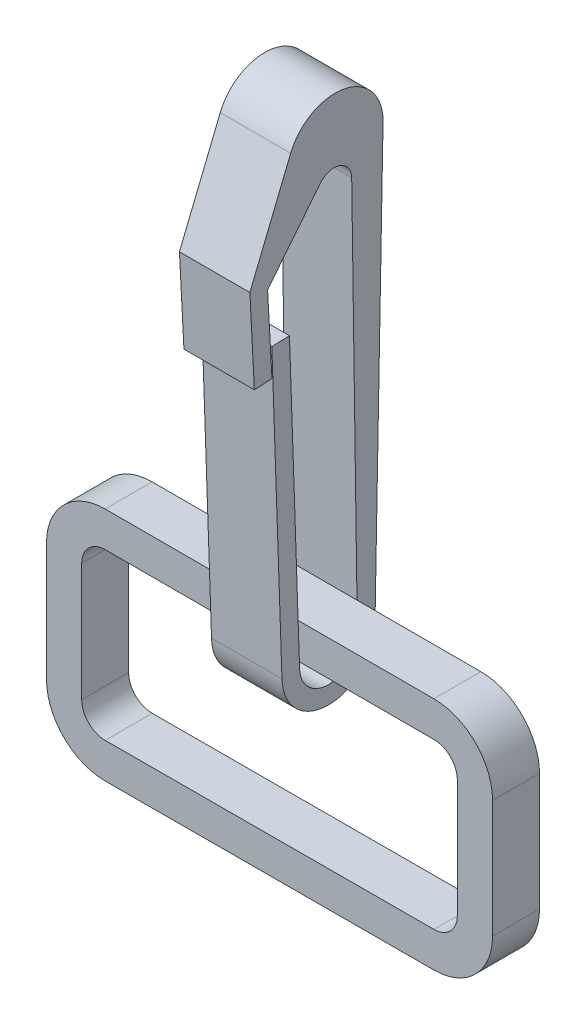
ISO-10303-21;
HEADER;
FILE_DESCRIPTION(('STEP AP214'),'2;1');
FILE_NAME('part.step','',(''),(''),'','','');
FILE_SCHEMA(('AUTOMOTIVE_DESIGN { 1 0 10303 214 1 1 1 1 }'));
ENDSEC;
DATA;
#1=APPLICATION_CONTEXT('core data for automotive mechanical design processes');
#2=APPLICATION_PROTOCOL_DEFINITION('international standard','automotive_design',2000,#1);
#3=PRODUCT_CONTEXT('',#1,'mechanical');
#4=PRODUCT('Part','Part','',(#3));
#5=PRODUCT_RELATED_PRODUCT_CATEGORY('part','',(#4));
#6=PRODUCT_DEFINITION_FORMATION('','',#4);
#7=PRODUCT_DEFINITION_CONTEXT('part definition',#1,'design');
#8=PRODUCT_DEFINITION('design','',#6,#7);
#9=PRODUCT_DEFINITION_SHAPE('','',#8);
#10=(LENGTH_UNIT() NAMED_UNIT(*) SI_UNIT(.MILLI.,.METRE.));
#11=(NAMED_UNIT(*) PLANE_ANGLE_UNIT() SI_UNIT($,.RADIAN.));
#12=(NAMED_UNIT(*) SI_UNIT($,.STERADIAN.) SOLID_ANGLE_UNIT());
#13=UNCERTAINTY_MEASURE_WITH_UNIT(LENGTH_MEASURE(1.E-05),#10,'distance_accuracy_value','');
#14=(GEOMETRIC_REPRESENTATION_CONTEXT(3) GLOBAL_UNCERTAINTY_ASSIGNED_CONTEXT((#13)) GLOBAL_UNIT_ASSIGNED_CONTEXT((#10,
#11,#12)) REPRESENTATION_CONTEXT('',''));
#15=CARTESIAN_POINT('',(0.,0.,0.));
#16=DIRECTION('',(0.,0.,1.));
#17=DIRECTION('',(1.,0.,0.));
#18=AXIS2_PLACEMENT_3D('',#15,#16,#17);
#19=CARTESIAN_POINT('',(15.9999597397409,17.0694992795226,1.97729722833447));
#20=DIRECTION('',(1.,0.,0.));
#21=DIRECTION('',(0.,0.,-1.));
#22=AXIS2_PLACEMENT_3D('',#19,#20,#21);
#23=CYLINDRICAL_SURFACE('',#22,2.46277891064654);
#24=DIRECTION('',(1.,0.,0.));
#25=VECTOR('',#24,1.);
#26=CARTESIAN_POINT('',(15.9999597397409,17.0469641502624,4.43997303539364));
#27=LINE('',#26,#25);
#28=CARTESIAN_POINT('',(15.9999597397409,17.0469641502624,4.43997303539364));
#29=VERTEX_POINT('',#28);
#30=CARTESIAN_POINT('',(21.9999597397409,17.0469641502624,4.43997303539364));
#31=VERTEX_POINT('',#30);
#32=EDGE_CURVE('E45',#29,#31,#27,.T.);
#33=ORIENTED_EDGE('',*,*,#32,.T.);
#34=CARTESIAN_POINT('',(21.9999597397409,17.0694992795226,1.97729722833447));
#35=DIRECTION('',(-1.,0.,0.));
#36=DIRECTION('',(0.,0.,1.));
#37=AXIS2_PLACEMENT_3D('',#34,#35,#36);
#38=CIRCLE('',#37,2.46277891064654);
#39=CARTESIAN_POINT('',(21.9999597397409,17.1257531872861,-0.48483913275252));
#40=VERTEX_POINT('',#39);
#41=EDGE_CURVE('E142',#40,#31,#38,.T.);
#42=ORIENTED_EDGE('',*,*,#41,.F.);
#43=DIRECTION('',(1.,0.,0.));
#44=VECTOR('',#43,1.);
#45=CARTESIAN_POINT('',(15.9999597397409,17.1257531872861,-0.48483913275252));
#46=LINE('',#45,#44);
#47=CARTESIAN_POINT('',(15.9999597397409,17.1257531872861,-0.48483913275252));
#48=VERTEX_POINT('',#47);
#49=EDGE_CURVE('E12',#48,#40,#46,.T.);
#50=ORIENTED_EDGE('',*,*,#49,.F.);
#51=CARTESIAN_POINT('',(15.9999597397409,17.0694992795226,1.97729722833447));
#52=DIRECTION('',(-1.,0.,0.));
#53=DIRECTION('',(0.,0.,1.));
#54=AXIS2_PLACEMENT_3D('',#51,#52,#53);
#55=CIRCLE('',#54,2.46277891064654);
#56=EDGE_CURVE('E143',#48,#29,#55,.T.);
#57=ORIENTED_EDGE('',*,*,#56,.T.);
#58=EDGE_LOOP('',(#33,#42,#50,#57));
#59=FACE_BOUND('',#58,.T.);
#60=ADVANCED_FACE('F42',(#59),#23,.F.);
#61=CARTESIAN_POINT('',(15.9999597397409,17.1257531872861,-0.48483913275252));
#62=DIRECTION('',(0.,-0.0143050781268201,0.999897677134908));
#63=DIRECTION('',(0.,-0.999897677134909,-0.0143050781268201));
#64=AXIS2_PLACEMENT_3D('',#61,#62,#63);
#65=PLANE('',#64);
#66=ORIENTED_EDGE('',*,*,#49,.T.);
#67=DIRECTION('',(0.,-0.999897677134909,-0.0143050781268201));
#68=VECTOR('',#67,1.);
#69=CARTESIAN_POINT('',(21.9999597397409,17.1257531872861,-0.48483913275252));
#70=LINE('',#69,#68);
#71=CARTESIAN_POINT('',(21.9999597397409,51.0258120976155,0.000153484297670892));
#72=VERTEX_POINT('',#71);
#73=EDGE_CURVE('E160',#72,#40,#70,.T.);
#74=ORIENTED_EDGE('',*,*,#73,.F.);
#75=DIRECTION('',(1.,0.,0.));
#76=VECTOR('',#75,1.);
#77=CARTESIAN_POINT('',(15.9999597397409,51.0258120976155,0.000153484297670892));
#78=LINE('',#77,#76);
#79=CARTESIAN_POINT('',(15.9999597397409,51.0258120976155,0.000153484297670892));
#80=VERTEX_POINT('',#79);
#81=EDGE_CURVE('E50',#80,#72,#78,.T.);
#82=ORIENTED_EDGE('',*,*,#81,.F.);
#83=DIRECTION('',(0.,-0.999897677134909,-0.0143050781268201));
#84=VECTOR('',#83,1.);
#85=CARTESIAN_POINT('',(15.9999597397409,17.1257531872861,-0.48483913275252));
#86=LINE('',#85,#84);
#87=EDGE_CURVE('E148',#80,#48,#86,.T.);
#88=ORIENTED_EDGE('',*,*,#87,.T.);
#89=EDGE_LOOP('',(#66,#74,#82,#88));
#90=FACE_BOUND('',#89,.T.);
#91=ADVANCED_FACE('F296',(#90),#65,.T.);
#92=CARTESIAN_POINT('',(15.9999597397409,51.0043544804253,1.5));
#93=DIRECTION('',(1.,0.,0.));
#94=DIRECTION('',(0.,0.,-1.));
#95=AXIS2_PLACEMENT_3D('',#92,#93,#94);
#96=CYLINDRICAL_SURFACE('',#95,1.49999999999998);
#97=ORIENTED_EDGE('',*,*,#81,.T.);
#98=CARTESIAN_POINT('',(21.9999597397409,51.0043544804253,1.5));
#99=DIRECTION('',(-1.,0.,0.));
#100=DIRECTION('',(0.,0.,1.));
#101=AXIS2_PLACEMENT_3D('',#98,#99,#100);
#102=CIRCLE('',#101,1.49999999999998);
#103=CARTESIAN_POINT('',(21.9999597397409,51.9420449274425,2.67078461963446));
#104=VERTEX_POINT('',#103);
#105=EDGE_CURVE('E191',#104,#72,#102,.T.);
#106=ORIENTED_EDGE('',*,*,#105,.F.);
#107=DIRECTION('',(1.,0.,0.));
#108=VECTOR('',#107,1.);
#109=CARTESIAN_POINT('',(15.9999597397409,51.9420449274425,2.67078461963446));
#110=LINE('',#109,#108);
#111=CARTESIAN_POINT('',(15.9999597397409,51.9420449274425,2.67078461963446));
#112=VERTEX_POINT('',#111);
#113=EDGE_CURVE('E231',#112,#104,#110,.T.);
#114=ORIENTED_EDGE('',*,*,#113,.F.);
#115=CARTESIAN_POINT('',(15.9999597397409,51.0043544804253,1.5));
#116=DIRECTION('',(-1.,0.,0.));
#117=DIRECTION('',(0.,0.,1.));
#118=AXIS2_PLACEMENT_3D('',#115,#116,#117);
#119=CIRCLE('',#118,1.49999999999998);
#120=EDGE_CURVE('E227',#112,#80,#119,.T.);
#121=ORIENTED_EDGE('',*,*,#120,.T.);
#122=EDGE_LOOP('',(#97,#106,#114,#121));
#123=FACE_BOUND('',#122,.T.);
#124=ADVANCED_FACE('F295',(#123),#96,.F.);
#125=CARTESIAN_POINT('',(15.9999597397409,51.9420449274425,2.67078461963448));
#126=DIRECTION('',(0.,-0.625126964678174,-0.780523079756296));
#127=DIRECTION('',(0.,0.780523079756296,-0.625126964678174));
#128=AXIS2_PLACEMENT_3D('',#125,#126,#127);
#129=PLANE('',#128);
#130=ORIENTED_EDGE('',*,*,#113,.T.);
#131=DIRECTION('',(0.,0.780523079756296,-0.625126964678174));
#132=VECTOR('',#131,1.);
#133=CARTESIAN_POINT('',(21.9999597397409,51.9420449274425,2.67078461963448));
#134=LINE('',#133,#132);
#135=CARTESIAN_POINT('',(21.9999597397409,46.3311054481699,7.16462939712118));
#136=VERTEX_POINT('',#135);
#137=EDGE_CURVE('E188',#136,#104,#134,.T.);
#138=ORIENTED_EDGE('',*,*,#137,.F.);
#139=DIRECTION('',(1.,0.,0.));
#140=VECTOR('',#139,1.);
#141=CARTESIAN_POINT('',(15.9999597397409,46.3311054481699,7.16462939712118));
#142=LINE('',#141,#140);
#143=CARTESIAN_POINT('',(15.9999597397409,46.3311054481699,7.16462939712118));
#144=VERTEX_POINT('',#143);
#145=EDGE_CURVE('E233',#144,#136,#142,.T.);
#146=ORIENTED_EDGE('',*,*,#145,.F.);
#147=DIRECTION('',(0.,0.780523079756296,-0.625126964678174));
#148=VECTOR('',#147,1.);
#149=CARTESIAN_POINT('',(15.9999597397409,51.9420449274425,2.67078461963448));
#150=LINE('',#149,#148);
#151=EDGE_CURVE('E224',#144,#112,#150,.T.);
#152=ORIENTED_EDGE('',*,*,#151,.T.);
#153=EDGE_LOOP('',(#130,#138,#146,#152));
#154=FACE_BOUND('',#153,.T.);
#155=ADVANCED_FACE('F291',(#154),#129,.T.);
#156=CARTESIAN_POINT('',(15.9999597397409,39.5964449052052,6.7930216978305));
#157=DIRECTION('',(0.,0.0550945778124409,-0.99848114028041));
#158=DIRECTION('',(0.,0.998481140280411,0.055094577812441));
#159=AXIS2_PLACEMENT_3D('',#156,#157,#158);
#160=PLANE('',#159);
#161=ORIENTED_EDGE('',*,*,#145,.T.);
#162=DIRECTION('',(0.,0.998481140280411,0.0550945778124409));
#163=VECTOR('',#162,1.);
#164=CARTESIAN_POINT('',(21.9999597397409,39.5964449052052,6.7930216978305));
#165=LINE('',#164,#163);
#166=CARTESIAN_POINT('',(21.9999597397409,39.5964449052052,6.7930216978305));
#167=VERTEX_POINT('',#166);
#168=EDGE_CURVE('E185',#167,#136,#165,.T.);
#169=ORIENTED_EDGE('',*,*,#168,.F.);
#170=DIRECTION('',(1.,0.,0.));
#171=VECTOR('',#170,1.);
#172=CARTESIAN_POINT('',(15.9999597397409,39.5964449052052,6.7930216978305));
#173=LINE('',#172,#171);
#174=CARTESIAN_POINT('',(15.9999597397409,39.5964449052052,6.7930216978305));
#175=VERTEX_POINT('',#174);
#176=EDGE_CURVE('E235',#175,#167,#173,.T.);
#177=ORIENTED_EDGE('',*,*,#176,.F.);
#178=DIRECTION('',(0.,0.998481140280411,0.0550945778124409));
#179=VECTOR('',#178,1.);
#180=CARTESIAN_POINT('',(15.9999597397409,39.5964449052052,6.7930216978305));
#181=LINE('',#180,#179);
#182=EDGE_CURVE('E221',#175,#144,#181,.T.);
#183=ORIENTED_EDGE('',*,*,#182,.T.);
#184=EDGE_LOOP('',(#161,#169,#177,#183));
#185=FACE_BOUND('',#184,.T.);
#186=ADVANCED_FACE('F286',(#185),#160,.T.);
#187=CARTESIAN_POINT('',(15.9999597397409,39.5964449052052,6.7930216978305));
#188=DIRECTION('',(0.,-0.998657404975044,-0.0518014236147121));
#189=DIRECTION('',(0.,0.0518014236147121,-0.998657404975044));
#190=AXIS2_PLACEMENT_3D('',#187,#188,#189);
#191=PLANE('',#190);
#192=ORIENTED_EDGE('',*,*,#176,.T.);
#193=DIRECTION('',(0.,0.0518014236147122,-0.998657404975044));
#194=VECTOR('',#193,1.);
#195=CARTESIAN_POINT('',(21.9999597397409,39.5964449052052,6.7930216978305));
#196=LINE('',#195,#194);
#197=CARTESIAN_POINT('',(21.9999597397409,39.5187427697831,8.29100780529306));
#198=VERTEX_POINT('',#197);
#199=EDGE_CURVE('E182',#198,#167,#196,.T.);
#200=ORIENTED_EDGE('',*,*,#199,.F.);
#201=DIRECTION('',(1.,0.,0.));
#202=VECTOR('',#201,1.);
#203=CARTESIAN_POINT('',(15.9999597397409,39.5187427697831,8.29100780529306));
#204=LINE('',#203,#202);
#205=CARTESIAN_POINT('',(15.9999597397409,39.5187427697831,8.29100780529306));
#206=VERTEX_POINT('',#205);
#207=EDGE_CURVE('E237',#206,#198,#204,.T.);
#208=ORIENTED_EDGE('',*,*,#207,.F.);
#209=DIRECTION('',(0.,0.0518014236147122,-0.998657404975044));
#210=VECTOR('',#209,1.);
#211=CARTESIAN_POINT('',(15.9999597397409,39.5964449052052,6.7930216978305));
#212=LINE('',#211,#210);
#213=EDGE_CURVE('E218',#206,#175,#212,.T.);
#214=ORIENTED_EDGE('',*,*,#213,.T.);
#215=EDGE_LOOP('',(#192,#200,#208,#214));
#216=FACE_BOUND('',#215,.T.);
#217=ADVANCED_FACE('F284',(#216),#191,.T.);
#218=CARTESIAN_POINT('',(15.9999597397409,39.5187427697831,8.29100780529306));
#219=DIRECTION('',(0.,-0.0518014236147122,0.998657404975044));
#220=DIRECTION('',(0.,-0.998657404975044,-0.0518014236147122));
#221=AXIS2_PLACEMENT_3D('',#218,#219,#220);
#222=PLANE('',#221);
#223=ORIENTED_EDGE('',*,*,#207,.T.);
#224=DIRECTION('',(0.,-0.998657404975044,-0.0518014236147122));
#225=VECTOR('',#224,1.);
#226=CARTESIAN_POINT('',(21.9999597397409,39.5187427697831,8.29100780529306));
#227=LINE('',#226,#225);
#228=CARTESIAN_POINT('',(21.9999597397409,46.8889576926449,8.67330870593093));
#229=VERTEX_POINT('',#228);
#230=EDGE_CURVE('E179',#229,#198,#227,.T.);
#231=ORIENTED_EDGE('',*,*,#230,.F.);
#232=DIRECTION('',(1.,0.,0.));
#233=VECTOR('',#232,1.);
#234=CARTESIAN_POINT('',(15.9999597397409,46.8889576926449,8.67330870593093));
#235=LINE('',#234,#233);
#236=CARTESIAN_POINT('',(15.9999597397409,46.8889576926449,8.67330870593093));
#237=VERTEX_POINT('',#236);
#238=EDGE_CURVE('E239',#237,#229,#235,.T.);
#239=ORIENTED_EDGE('',*,*,#238,.F.);
#240=DIRECTION('',(0.,-0.998657404975044,-0.0518014236147122));
#241=VECTOR('',#240,1.);
#242=CARTESIAN_POINT('',(15.9999597397409,39.5187427697831,8.29100780529306));
#243=LINE('',#242,#241);
#244=EDGE_CURVE('E215',#237,#206,#243,.T.);
#245=ORIENTED_EDGE('',*,*,#244,.T.);
#246=EDGE_LOOP('',(#223,#231,#239,#245));
#247=FACE_BOUND('',#246,.T.);
#248=ADVANCED_FACE('F279',(#247),#222,.T.);
#249=CARTESIAN_POINT('',(15.9999597397409,46.8889576926449,8.67330870593093));
#250=DIRECTION('',(0.,0.377156953165517,0.926149357651834));
#251=DIRECTION('',(0.,-0.926149357651834,0.377156953165517));
#252=AXIS2_PLACEMENT_3D('',#249,#250,#251);
#253=PLANE('',#252);
#254=ORIENTED_EDGE('',*,*,#238,.T.);
#255=DIRECTION('',(0.,-0.926149357651833,0.377156953165517));
#256=VECTOR('',#255,1.);
#257=CARTESIAN_POINT('',(21.9999597397409,46.8889576926449,8.67330870593093));
#258=LINE('',#257,#256);
#259=CARTESIAN_POINT('',(21.9999597397409,55.4196618053297,5.19933947525067));
#260=VERTEX_POINT('',#259);
#261=EDGE_CURVE('E176',#260,#229,#258,.T.);
#262=ORIENTED_EDGE('',*,*,#261,.F.);
#263=DIRECTION('',(1.,0.,0.));
#264=VECTOR('',#263,1.);
#265=CARTESIAN_POINT('',(15.9999597397409,55.4196618053297,5.19933947525067));
#266=LINE('',#265,#264);
#267=CARTESIAN_POINT('',(15.9999597397409,55.4196618053297,5.19933947525067));
#268=VERTEX_POINT('',#267);
#269=EDGE_CURVE('E241',#268,#260,#266,.T.);
#270=ORIENTED_EDGE('',*,*,#269,.F.);
#271=DIRECTION('',(0.,-0.926149357651833,0.377156953165517));
#272=VECTOR('',#271,1.);
#273=CARTESIAN_POINT('',(15.9999597397409,46.8889576926449,8.67330870593093));
#274=LINE('',#273,#272);
#275=EDGE_CURVE('E212',#268,#237,#274,.T.);
#276=ORIENTED_EDGE('',*,*,#275,.T.);
#277=EDGE_LOOP('',(#254,#262,#270,#276));
#278=FACE_BOUND('',#277,.T.);
#279=ADVANCED_FACE('F274',(#278),#253,.T.);
#280=CARTESIAN_POINT('',(15.9999597397409,53.8784471881725,1.41472165048711));
#281=DIRECTION('',(1.,0.,0.));
#282=DIRECTION('',(0.,0.,-1.));
#283=AXIS2_PLACEMENT_3D('',#280,#281,#282);
#284=CYLINDRICAL_SURFACE('',#283,4.08640117654361);
#285=ORIENTED_EDGE('',*,*,#269,.T.);
#286=CARTESIAN_POINT('',(21.9999597397409,53.8784471881725,1.41472165048711));
#287=DIRECTION('',(1.,0.,0.));
#288=DIRECTION('',(0.,0.,-1.));
#289=AXIS2_PLACEMENT_3D('',#286,#287,#288);
#290=CIRCLE('',#289,4.08640117654361);
#291=CARTESIAN_POINT('',(21.9999597397409,53.7480618556889,-2.6695988855054));
#292=VERTEX_POINT('',#291);
#293=EDGE_CURVE('E173',#292,#260,#290,.T.);
#294=ORIENTED_EDGE('',*,*,#293,.F.);
#295=DIRECTION('',(1.,0.,0.));
#296=VECTOR('',#295,1.);
#297=CARTESIAN_POINT('',(15.9999597397409,53.7480618556889,-2.6695988855054));
#298=LINE('',#297,#296);
#299=CARTESIAN_POINT('',(15.9999597397409,53.7480618556889,-2.6695988855054));
#300=VERTEX_POINT('',#299);
#301=EDGE_CURVE('E243',#300,#292,#298,.T.);
#302=ORIENTED_EDGE('',*,*,#301,.F.);
#303=CARTESIAN_POINT('',(15.9999597397409,53.8784471881725,1.41472165048711));
#304=DIRECTION('',(1.,0.,0.));
#305=DIRECTION('',(0.,0.,-1.));
#306=AXIS2_PLACEMENT_3D('',#303,#304,#305);
#307=CIRCLE('',#306,4.08640117654361);
#308=EDGE_CURVE('E209',#300,#268,#307,.T.);
#309=ORIENTED_EDGE('',*,*,#308,.T.);
#310=EDGE_LOOP('',(#285,#294,#302,#309));
#311=FACE_BOUND('',#310,.T.);
#312=ADVANCED_FACE('F272',(#311),#284,.T.);
#313=CARTESIAN_POINT('',(15.9999597397409,17.1600156463645,-1.98444777633187));
#314=DIRECTION('',(0.,-0.0187228092766899,-0.999824712843601));
#315=DIRECTION('',(0.,0.999824712843601,-0.0187228092766899));
#316=AXIS2_PLACEMENT_3D('',#313,#314,#315);
#317=PLANE('',#316);
#318=ORIENTED_EDGE('',*,*,#301,.T.);
#319=DIRECTION('',(0.,0.999824712843601,-0.0187228092766899));
#320=VECTOR('',#319,1.);
#321=CARTESIAN_POINT('',(21.9999597397409,17.1600156463645,-1.98444777633187));
#322=LINE('',#321,#320);
#323=CARTESIAN_POINT('',(21.9999597397409,17.1600156463645,-1.98444777633187));
#324=VERTEX_POINT('',#323);
#325=EDGE_CURVE('E170',#324,#292,#322,.T.);
#326=ORIENTED_EDGE('',*,*,#325,.F.);
#327=DIRECTION('',(1.,0.,0.));
#328=VECTOR('',#327,1.);
#329=CARTESIAN_POINT('',(15.9999597397409,17.1600156463645,-1.98444777633187));
#330=LINE('',#329,#328);
#331=CARTESIAN_POINT('',(15.9999597397409,17.1600156463645,-1.98444777633187));
#332=VERTEX_POINT('',#331);
#333=EDGE_CURVE('E245',#332,#324,#330,.T.);
#334=ORIENTED_EDGE('',*,*,#333,.F.);
#335=DIRECTION('',(0.,0.999824712843601,-0.0187228092766899));
#336=VECTOR('',#335,1.);
#337=CARTESIAN_POINT('',(15.9999597397409,17.1600156463645,-1.98444777633187));
#338=LINE('',#337,#336);
#339=EDGE_CURVE('E206',#332,#300,#338,.T.);
#340=ORIENTED_EDGE('',*,*,#339,.T.);
#341=EDGE_LOOP('',(#318,#326,#334,#340));
#342=FACE_BOUND('',#341,.T.);
#343=ADVANCED_FACE('F267',(#342),#317,.T.);
#344=CARTESIAN_POINT('',(15.9999597397409,17.0694992795226,1.97729722833447));
#345=DIRECTION('',(1.,0.,0.));
#346=DIRECTION('',(0.,0.,-1.));
#347=AXIS2_PLACEMENT_3D('',#344,#345,#346);
#348=CYLINDRICAL_SURFACE('',#347,3.96277891064654);
#349=ORIENTED_EDGE('',*,*,#333,.T.);
#350=CARTESIAN_POINT('',(21.9999597397409,17.0694992795226,1.97729722833447));
#351=DIRECTION('',(1.,0.,0.));
#352=DIRECTION('',(0.,0.,1.));
#353=AXIS2_PLACEMENT_3D('',#350,#351,#352);
#354=CIRCLE('',#353,3.96277891064654);
#355=CARTESIAN_POINT('',(21.9999597397409,17.011974714684,5.93965859740532));
#356=VERTEX_POINT('',#355);
#357=EDGE_CURVE('E167',#356,#324,#354,.T.);
#358=ORIENTED_EDGE('',*,*,#357,.F.);
#359=DIRECTION('',(1.,0.,0.));
#360=VECTOR('',#359,1.);
#361=CARTESIAN_POINT('',(15.9999597397409,17.011974714684,5.93965859740532));
#362=LINE('',#361,#360);
#363=CARTESIAN_POINT('',(15.9999597397409,17.011974714684,5.93965859740532));
#364=VERTEX_POINT('',#363);
#365=EDGE_CURVE('E247',#364,#356,#362,.T.);
#366=ORIENTED_EDGE('',*,*,#365,.F.);
#367=CARTESIAN_POINT('',(15.9999597397409,17.0694992795226,1.97729722833447));
#368=DIRECTION('',(1.,0.,0.));
#369=DIRECTION('',(0.,0.,1.));
#370=AXIS2_PLACEMENT_3D('',#367,#368,#369);
#371=CIRCLE('',#370,3.96277891064654);
#372=EDGE_CURVE('E203',#364,#332,#371,.T.);
#373=ORIENTED_EDGE('',*,*,#372,.T.);
#374=EDGE_LOOP('',(#349,#358,#366,#373));
#375=FACE_BOUND('',#374,.T.);
#376=ADVANCED_FACE('F260',(#375),#348,.T.);
#377=CARTESIAN_POINT('',(15.9999597397409,17.011974714684,5.93965859740532));
#378=DIRECTION('',(0.,-0.0344959133417966,0.999404838872974));
#379=DIRECTION('',(0.,-0.999404838872974,-0.0344959133417966));
#380=AXIS2_PLACEMENT_3D('',#377,#378,#379);
#381=PLANE('',#380);
#382=ORIENTED_EDGE('',*,*,#365,.T.);
#383=DIRECTION('',(0.,-0.999404838872974,-0.0344959133417966));
#384=VECTOR('',#383,1.);
#385=CARTESIAN_POINT('',(21.9999597397409,17.011974714684,5.93965859740532));
#386=LINE('',#385,#384);
#387=CARTESIAN_POINT('',(21.9999597397409,41.9647859329318,6.80094121275625));
#388=VERTEX_POINT('',#387);
#389=EDGE_CURVE('E164',#388,#356,#386,.T.);
#390=ORIENTED_EDGE('',*,*,#389,.F.);
#391=DIRECTION('',(1.,0.,0.));
#392=VECTOR('',#391,1.);
#393=CARTESIAN_POINT('',(15.9999597397409,41.9647859329318,6.80094121275625));
#394=LINE('',#393,#392);
#395=CARTESIAN_POINT('',(15.9999597397409,41.9647859329318,6.80094121275625));
#396=VERTEX_POINT('',#395);
#397=EDGE_CURVE('E249',#396,#388,#394,.T.);
#398=ORIENTED_EDGE('',*,*,#397,.F.);
#399=DIRECTION('',(0.,-0.999404838872974,-0.0344959133417966));
#400=VECTOR('',#399,1.);
#401=CARTESIAN_POINT('',(15.9999597397409,17.011974714684,5.93965859740532));
#402=LINE('',#401,#400);
#403=EDGE_CURVE('E200',#396,#364,#402,.T.);
#404=ORIENTED_EDGE('',*,*,#403,.T.);
#405=EDGE_LOOP('',(#382,#390,#398,#404));
#406=FACE_BOUND('',#405,.T.);
#407=ADVANCED_FACE('F257',(#406),#381,.T.);
#408=CARTESIAN_POINT('',(15.9999597397409,42.0165298029445,5.30183395444679));
#409=DIRECTION('',(0.,0.999404838872974,0.0344959133417958));
#410=DIRECTION('',(0.,-0.0344959133417959,0.999404838872974));
#411=AXIS2_PLACEMENT_3D('',#408,#409,#410);
#412=PLANE('',#411);
#413=ORIENTED_EDGE('',*,*,#397,.T.);
#414=DIRECTION('',(0.,-0.0344959133417958,0.999404838872974));
#415=VECTOR('',#414,1.);
#416=CARTESIAN_POINT('',(21.9999597397409,42.0165298029445,5.30183395444679));
#417=LINE('',#416,#415);
#418=CARTESIAN_POINT('',(21.9999597397409,42.0165298029445,5.30183395444679));
#419=VERTEX_POINT('',#418);
#420=EDGE_CURVE('E155',#419,#388,#417,.T.);
#421=ORIENTED_EDGE('',*,*,#420,.F.);
#422=DIRECTION('',(1.,0.,0.));
#423=VECTOR('',#422,1.);
#424=CARTESIAN_POINT('',(15.9999597397409,42.0165298029445,5.30183395444679));
#425=LINE('',#424,#423);
#426=CARTESIAN_POINT('',(15.9999597397409,42.0165298029445,5.30183395444679));
#427=VERTEX_POINT('',#426);
#428=EDGE_CURVE('E147',#427,#419,#425,.T.);
#429=ORIENTED_EDGE('',*,*,#428,.F.);
#430=DIRECTION('',(0.,-0.0344959133417958,0.999404838872974));
#431=VECTOR('',#430,1.);
#432=CARTESIAN_POINT('',(15.9999597397409,42.0165298029445,5.30183395444679));
#433=LINE('',#432,#431);
#434=EDGE_CURVE('E197',#427,#396,#433,.T.);
#435=ORIENTED_EDGE('',*,*,#434,.T.);
#436=EDGE_LOOP('',(#413,#421,#429,#435));
#437=FACE_BOUND('',#436,.T.);
#438=ADVANCED_FACE('F251',(#437),#412,.T.);
#439=CARTESIAN_POINT('',(15.9999597397409,17.0469641502624,4.43997303539364));
#440=DIRECTION('',(0.,0.0344959133417966,-0.999404838872974));
#441=DIRECTION('',(0.,0.999404838872974,0.0344959133417966));
#442=AXIS2_PLACEMENT_3D('',#439,#440,#441);
#443=PLANE('',#442);
#444=ORIENTED_EDGE('',*,*,#428,.T.);
#445=DIRECTION('',(0.,0.999404838872974,0.0344959133417966));
#446=VECTOR('',#445,1.);
#447=CARTESIAN_POINT('',(21.9999597397409,17.0469641502624,4.43997303539364));
#448=LINE('',#447,#446);
#449=EDGE_CURVE('E150',#31,#419,#448,.T.);
#450=ORIENTED_EDGE('',*,*,#449,.F.);
#451=ORIENTED_EDGE('',*,*,#32,.F.);
#452=DIRECTION('',(0.,0.999404838872974,0.0344959133417966));
#453=VECTOR('',#452,1.);
#454=CARTESIAN_POINT('',(15.9999597397409,17.0469641502624,4.43997303539364));
#455=LINE('',#454,#453);
#456=EDGE_CURVE('E195',#29,#427,#455,.T.);
#457=ORIENTED_EDGE('',*,*,#456,.T.);
#458=EDGE_LOOP('',(#444,#450,#451,#457));
#459=FACE_BOUND('',#458,.T.);
#460=ADVANCED_FACE('F151',(#459),#443,.T.);
#461=CARTESIAN_POINT('',(15.9999597397409,17.0694992795226,1.97729722833447));
#462=DIRECTION('',(-1.,0.,0.));
#463=DIRECTION('',(0.,0.,1.));
#464=AXIS2_PLACEMENT_3D('',#461,#462,#463);
#465=PLANE('',#464);
#466=ORIENTED_EDGE('',*,*,#56,.F.);
#467=ORIENTED_EDGE('',*,*,#87,.F.);
#468=ORIENTED_EDGE('',*,*,#120,.F.);
#469=ORIENTED_EDGE('',*,*,#151,.F.);
#470=ORIENTED_EDGE('',*,*,#182,.F.);
#471=ORIENTED_EDGE('',*,*,#213,.F.);
#472=ORIENTED_EDGE('',*,*,#244,.F.);
#473=ORIENTED_EDGE('',*,*,#275,.F.);
#474=ORIENTED_EDGE('',*,*,#308,.F.);
#475=ORIENTED_EDGE('',*,*,#339,.F.);
#476=ORIENTED_EDGE('',*,*,#372,.F.);
#477=ORIENTED_EDGE('',*,*,#403,.F.);
#478=ORIENTED_EDGE('',*,*,#434,.F.);
#479=ORIENTED_EDGE('',*,*,#456,.F.);
#480=EDGE_LOOP('',(#466,#467,#468,#469,#470,#471,#472,#473,#474,#475,#476,#477,#478,#479));
#481=FACE_BOUND('',#480,.T.);
#482=ADVANCED_FACE('F263',(#481),#465,.T.);
#483=CARTESIAN_POINT('',(21.9999597397409,17.0694992795226,1.97729722833447));
#484=DIRECTION('',(-1.,0.,0.));
#485=DIRECTION('',(0.,0.,1.));
#486=AXIS2_PLACEMENT_3D('',#483,#484,#485);
#487=PLANE('',#486);
#488=ORIENTED_EDGE('',*,*,#41,.T.);
#489=ORIENTED_EDGE('',*,*,#449,.T.);
#490=ORIENTED_EDGE('',*,*,#420,.T.);
#491=ORIENTED_EDGE('',*,*,#389,.T.);
#492=ORIENTED_EDGE('',*,*,#357,.T.);
#493=ORIENTED_EDGE('',*,*,#325,.T.);
#494=ORIENTED_EDGE('',*,*,#293,.T.);
#495=ORIENTED_EDGE('',*,*,#261,.T.);
#496=ORIENTED_EDGE('',*,*,#230,.T.);
#497=ORIENTED_EDGE('',*,*,#199,.T.);
#498=ORIENTED_EDGE('',*,*,#168,.T.);
#499=ORIENTED_EDGE('',*,*,#137,.T.);
#500=ORIENTED_EDGE('',*,*,#105,.T.);
#501=ORIENTED_EDGE('',*,*,#73,.T.);
#502=EDGE_LOOP('',(#488,#489,#490,#491,#492,#493,#494,#495,#496,#497,#498,#499,#500,#501));
#503=FACE_BOUND('',#502,.T.);
#504=ADVANCED_FACE('F158',(#503),#487,.F.);
#505=CLOSED_SHELL('',(#60,#91,#124,#155,#186,#217,#248,#279,#312,#343,#376,#407,#438,#460,#482,#504));
#506=MANIFOLD_SOLID_BREP('B2',#505);
#507=CARTESIAN_POINT('',(5.,15.078227571116,4.));
#508=DIRECTION('',(0.,0.,-1.));
#509=DIRECTION('',(-1.,0.,0.));
#510=AXIS2_PLACEMENT_3D('',#507,#508,#509);
#511=PLANE('',#510);
#512=CARTESIAN_POINT('',(5.,15.078227571116,4.));
#513=DIRECTION('',(0.,0.,1.));
#514=DIRECTION('',(-1.,0.,0.));
#515=AXIS2_PLACEMENT_3D('',#512,#513,#514);
#516=CIRCLE('',#515,5.);
#517=CARTESIAN_POINT('',(5.00000000000004,20.078227571116,4.));
#518=VERTEX_POINT('',#517);
#519=CARTESIAN_POINT('',(0.,15.0782275711159,4.));
#520=VERTEX_POINT('',#519);
#521=EDGE_CURVE('E603',#518,#520,#516,.T.);
#522=ORIENTED_EDGE('',*,*,#521,.T.);
#523=DIRECTION('',(0.,-1.,0.));
#524=VECTOR('',#523,1.);
#525=CARTESIAN_POINT('',(0.,5.01030371812221,4.));
#526=LINE('',#525,#524);
#527=CARTESIAN_POINT('',(0.,5.01030371812221,4.));
#528=VERTEX_POINT('',#527);
#529=EDGE_CURVE('E606',#520,#528,#526,.T.);
#530=ORIENTED_EDGE('',*,*,#529,.T.);
#531=CARTESIAN_POINT('',(5.,5.01030371812218,4.));
#532=DIRECTION('',(0.,0.,1.));
#533=DIRECTION('',(-1.,0.,0.));
#534=AXIS2_PLACEMENT_3D('',#531,#532,#533);
#535=CIRCLE('',#534,5.);
#536=CARTESIAN_POINT('',(5.010293101484,0.0103143129272154,4.));
#537=VERTEX_POINT('',#536);
#538=EDGE_CURVE('E609',#528,#537,#535,.T.);
#539=ORIENTED_EDGE('',*,*,#538,.T.);
#540=DIRECTION('',(0.999997881038992,0.00205862029679142,0.));
#541=VECTOR('',#540,1.);
#542=CARTESIAN_POINT('',(5.01029310148399,0.0103143129272159,4.));
#543=LINE('',#542,#541);
#544=CARTESIAN_POINT('',(33.0102125809656,0.0679556376159216,4.));
#545=VERTEX_POINT('',#544);
#546=EDGE_CURVE('E611',#537,#545,#543,.T.);
#547=ORIENTED_EDGE('',*,*,#546,.T.);
#548=CARTESIAN_POINT('',(32.9999194794817,5.06794504281088,4.));
#549=DIRECTION('',(0.,0.,1.));
#550=DIRECTION('',(1.,0.,0.));
#551=AXIS2_PLACEMENT_3D('',#548,#549,#550);
#552=CIRCLE('',#551,5.);
#553=CARTESIAN_POINT('',(37.9999194794817,5.06794504281088,4.));
#554=VERTEX_POINT('',#553);
#555=EDGE_CURVE('E613',#545,#554,#552,.T.);
#556=ORIENTED_EDGE('',*,*,#555,.T.);
#557=DIRECTION('',(0.,1.,0.));
#558=VECTOR('',#557,1.);
#559=CARTESIAN_POINT('',(37.9999194794817,5.06794504281088,4.));
#560=LINE('',#559,#558);
#561=CARTESIAN_POINT('',(37.9999194794817,15.078227571116,4.));
#562=VERTEX_POINT('',#561);
#563=EDGE_CURVE('E615',#554,#562,#560,.T.);
#564=ORIENTED_EDGE('',*,*,#563,.T.);
#565=CARTESIAN_POINT('',(32.9999194794817,15.078227571116,4.));
#566=DIRECTION('',(0.,0.,1.));
#567=DIRECTION('',(-1.,0.,0.));
#568=AXIS2_PLACEMENT_3D('',#565,#566,#567);
#569=CIRCLE('',#568,5.);
#570=CARTESIAN_POINT('',(32.9999194794817,20.078227571116,4.));
#571=VERTEX_POINT('',#570);
#572=EDGE_CURVE('E617',#562,#571,#569,.T.);
#573=ORIENTED_EDGE('',*,*,#572,.T.);
#574=DIRECTION('',(-1.,0.,0.));
#575=VECTOR('',#574,1.);
#576=CARTESIAN_POINT('',(5.00000000000004,20.078227571116,4.));
#577=LINE('',#576,#575);
#578=EDGE_CURVE('E619',#571,#518,#577,.T.);
#579=ORIENTED_EDGE('',*,*,#578,.T.);
#580=EDGE_LOOP('',(#522,#530,#539,#547,#556,#564,#573,#579));
#581=FACE_BOUND('',#580,.T.);
#582=CARTESIAN_POINT('',(5.,5.01030371812218,4.));
#583=DIRECTION('',(0.,0.,1.));
#584=DIRECTION('',(-1.,0.,0.));
#585=AXIS2_PLACEMENT_3D('',#582,#583,#584);
#586=CIRCLE('',#585,2.);
#587=CARTESIAN_POINT('',(3.,5.01030371812221,4.));
#588=VERTEX_POINT('',#587);
#589=CARTESIAN_POINT('',(5.00411724059362,3.01030795604419,4.));
#590=VERTEX_POINT('',#589);
#591=EDGE_CURVE('E538',#588,#590,#586,.T.);
#592=ORIENTED_EDGE('',*,*,#591,.F.);
#593=DIRECTION('',(0.,-1.,0.));
#594=VECTOR('',#593,1.);
#595=CARTESIAN_POINT('',(3.,5.01030371812221,4.));
#596=LINE('',#595,#594);
#597=CARTESIAN_POINT('',(3.,15.078227571116,4.));
#598=VERTEX_POINT('',#597);
#599=EDGE_CURVE('E571',#598,#588,#596,.T.);
#600=ORIENTED_EDGE('',*,*,#599,.F.);
#601=CARTESIAN_POINT('',(5.,15.078227571116,4.));
#602=DIRECTION('',(0.,0.,1.));
#603=DIRECTION('',(-1.,0.,0.));
#604=AXIS2_PLACEMENT_3D('',#601,#602,#603);
#605=CIRCLE('',#604,2.);
#606=CARTESIAN_POINT('',(5.00000000000004,17.078227571116,4.));
#607=VERTEX_POINT('',#606);
#608=EDGE_CURVE('E569',#607,#598,#605,.T.);
#609=ORIENTED_EDGE('',*,*,#608,.F.);
#610=DIRECTION('',(-1.,0.,0.));
#611=VECTOR('',#610,1.);
#612=CARTESIAN_POINT('',(5.00000000000004,17.078227571116,4.));
#613=LINE('',#612,#611);
#614=CARTESIAN_POINT('',(32.9999194794817,17.078227571116,4.));
#615=VERTEX_POINT('',#614);
#616=EDGE_CURVE('E567',#615,#607,#613,.T.);
#617=ORIENTED_EDGE('',*,*,#616,.F.);
#618=CARTESIAN_POINT('',(32.9999194794817,15.078227571116,4.));
#619=DIRECTION('',(0.,0.,1.));
#620=DIRECTION('',(-1.,0.,0.));
#621=AXIS2_PLACEMENT_3D('',#618,#619,#620);
#622=CIRCLE('',#621,2.);
#623=CARTESIAN_POINT('',(34.9999194794817,15.078227571116,4.));
#624=VERTEX_POINT('',#623);
#625=EDGE_CURVE('E565',#624,#615,#622,.T.);
#626=ORIENTED_EDGE('',*,*,#625,.F.);
#627=DIRECTION('',(0.,1.,0.));
#628=VECTOR('',#627,1.);
#629=CARTESIAN_POINT('',(34.9999194794817,5.06794504281088,4.));
#630=LINE('',#629,#628);
#631=CARTESIAN_POINT('',(34.9999194794817,5.06794504281088,4.));
#632=VERTEX_POINT('',#631);
#633=EDGE_CURVE('E561',#632,#624,#630,.T.);
#634=ORIENTED_EDGE('',*,*,#633,.F.);
#635=CARTESIAN_POINT('',(32.9999194794817,5.06794504281088,4.));
#636=DIRECTION('',(0.,0.,1.));
#637=DIRECTION('',(1.,0.,0.));
#638=AXIS2_PLACEMENT_3D('',#635,#636,#637);
#639=CIRCLE('',#638,2.);
#640=CARTESIAN_POINT('',(33.0040367200753,3.0679492807329,4.));
#641=VERTEX_POINT('',#640);
#642=EDGE_CURVE('E559',#641,#632,#639,.T.);
#643=ORIENTED_EDGE('',*,*,#642,.F.);
#644=DIRECTION('',(0.999997881038992,0.00205862029679145,0.));
#645=VECTOR('',#644,1.);
#646=CARTESIAN_POINT('',(5.00411724059362,3.01030795604419,4.));
#647=LINE('',#646,#645);
#648=EDGE_CURVE('E546',#590,#641,#647,.T.);
#649=ORIENTED_EDGE('',*,*,#648,.F.);
#650=EDGE_LOOP('',(#592,#600,#609,#617,#626,#634,#643,#649));
#651=FACE_BOUND('',#650,.T.);
#652=ADVANCED_FACE('F425',(#581,#651),#511,.F.);
#653=CARTESIAN_POINT('',(5.,15.078227571116,0.));
#654=DIRECTION('',(0.,0.,-1.));
#655=DIRECTION('',(-1.,0.,0.));
#656=AXIS2_PLACEMENT_3D('',#653,#654,#655);
#657=PLANE('',#656);
#658=CARTESIAN_POINT('',(5.,15.078227571116,0.));
#659=DIRECTION('',(0.,0.,1.));
#660=DIRECTION('',(-1.,0.,0.));
#661=AXIS2_PLACEMENT_3D('',#658,#659,#660);
#662=CIRCLE('',#661,5.);
#663=CARTESIAN_POINT('',(5.00000000000004,20.078227571116,0.));
#664=VERTEX_POINT('',#663);
#665=CARTESIAN_POINT('',(0.,15.0782275711159,0.));
#666=VERTEX_POINT('',#665);
#667=EDGE_CURVE('E554',#664,#666,#662,.T.);
#668=ORIENTED_EDGE('',*,*,#667,.F.);
#669=DIRECTION('',(-1.,0.,0.));
#670=VECTOR('',#669,1.);
#671=CARTESIAN_POINT('',(5.00000000000004,20.078227571116,0.));
#672=LINE('',#671,#670);
#673=CARTESIAN_POINT('',(32.9999194794817,20.078227571116,0.));
#674=VERTEX_POINT('',#673);
#675=EDGE_CURVE('E607',#674,#664,#672,.T.);
#676=ORIENTED_EDGE('',*,*,#675,.F.);
#677=CARTESIAN_POINT('',(32.9999194794817,15.078227571116,0.));
#678=DIRECTION('',(0.,0.,1.));
#679=DIRECTION('',(-1.,0.,0.));
#680=AXIS2_PLACEMENT_3D('',#677,#678,#679);
#681=CIRCLE('',#680,5.);
#682=CARTESIAN_POINT('',(37.9999194794817,15.078227571116,0.));
#683=VERTEX_POINT('',#682);
#684=EDGE_CURVE('E634',#683,#674,#681,.T.);
#685=ORIENTED_EDGE('',*,*,#684,.F.);
#686=DIRECTION('',(0.,1.,0.));
#687=VECTOR('',#686,1.);
#688=CARTESIAN_POINT('',(37.9999194794817,5.06794504281088,0.));
#689=LINE('',#688,#687);
#690=CARTESIAN_POINT('',(37.9999194794817,5.06794504281088,0.));
#691=VERTEX_POINT('',#690);
#692=EDGE_CURVE('E632',#691,#683,#689,.T.);
#693=ORIENTED_EDGE('',*,*,#692,.F.);
#694=CARTESIAN_POINT('',(32.9999194794817,5.06794504281088,0.));
#695=DIRECTION('',(0.,0.,1.));
#696=DIRECTION('',(1.,0.,0.));
#697=AXIS2_PLACEMENT_3D('',#694,#695,#696);
#698=CIRCLE('',#697,5.);
#699=CARTESIAN_POINT('',(33.0102125809656,0.0679556376159216,0.));
#700=VERTEX_POINT('',#699);
#701=EDGE_CURVE('E630',#700,#691,#698,.T.);
#702=ORIENTED_EDGE('',*,*,#701,.F.);
#703=DIRECTION('',(0.999997881038992,0.00205862029679142,0.));
#704=VECTOR('',#703,1.);
#705=CARTESIAN_POINT('',(5.01029310148399,0.0103143129272159,0.));
#706=LINE('',#705,#704);
#707=CARTESIAN_POINT('',(5.010293101484,0.0103143129272154,0.));
#708=VERTEX_POINT('',#707);
#709=EDGE_CURVE('E628',#708,#700,#706,.T.);
#710=ORIENTED_EDGE('',*,*,#709,.F.);
#711=CARTESIAN_POINT('',(5.,5.01030371812218,0.));
#712=DIRECTION('',(0.,0.,1.));
#713=DIRECTION('',(-1.,0.,0.));
#714=AXIS2_PLACEMENT_3D('',#711,#712,#713);
#715=CIRCLE('',#714,5.);
#716=CARTESIAN_POINT('',(0.,5.01030371812221,0.));
#717=VERTEX_POINT('',#716);
#718=EDGE_CURVE('E626',#717,#708,#715,.T.);
#719=ORIENTED_EDGE('',*,*,#718,.F.);
#720=DIRECTION('',(0.,-1.,0.));
#721=VECTOR('',#720,1.);
#722=CARTESIAN_POINT('',(0.,5.01030371812221,0.));
#723=LINE('',#722,#721);
#724=EDGE_CURVE('E624',#666,#717,#723,.T.);
#725=ORIENTED_EDGE('',*,*,#724,.F.);
#726=EDGE_LOOP('',(#668,#676,#685,#693,#702,#710,#719,#725));
#727=FACE_BOUND('',#726,.T.);
#728=DIRECTION('',(0.,-1.,0.));
#729=VECTOR('',#728,1.);
#730=CARTESIAN_POINT('',(3.,5.01030371812221,0.));
#731=LINE('',#730,#729);
#732=CARTESIAN_POINT('',(3.,15.078227571116,0.));
#733=VERTEX_POINT('',#732);
#734=CARTESIAN_POINT('',(3.,5.01030371812221,0.));
#735=VERTEX_POINT('',#734);
#736=EDGE_CURVE('E547',#733,#735,#731,.T.);
#737=ORIENTED_EDGE('',*,*,#736,.T.);
#738=CARTESIAN_POINT('',(5.,5.01030371812218,0.));
#739=DIRECTION('',(0.,0.,1.));
#740=DIRECTION('',(-1.,0.,0.));
#741=AXIS2_PLACEMENT_3D('',#738,#739,#740);
#742=CIRCLE('',#741,2.);
#743=CARTESIAN_POINT('',(5.00411724059362,3.01030795604419,0.));
#744=VERTEX_POINT('',#743);
#745=EDGE_CURVE('E448',#735,#744,#742,.T.);
#746=ORIENTED_EDGE('',*,*,#745,.T.);
#747=DIRECTION('',(0.999997881038992,0.00205862029679145,0.));
#748=VECTOR('',#747,1.);
#749=CARTESIAN_POINT('',(5.00411724059362,3.01030795604419,0.));
#750=LINE('',#749,#748);
#751=CARTESIAN_POINT('',(33.0040367200753,3.0679492807329,0.));
#752=VERTEX_POINT('',#751);
#753=EDGE_CURVE('E553',#744,#752,#750,.T.);
#754=ORIENTED_EDGE('',*,*,#753,.T.);
#755=CARTESIAN_POINT('',(32.9999194794817,5.06794504281088,0.));
#756=DIRECTION('',(0.,0.,1.));
#757=DIRECTION('',(1.,0.,0.));
#758=AXIS2_PLACEMENT_3D('',#755,#756,#757);
#759=CIRCLE('',#758,2.);
#760=CARTESIAN_POINT('',(34.9999194794817,5.06794504281088,0.));
#761=VERTEX_POINT('',#760);
#762=EDGE_CURVE('E575',#752,#761,#759,.T.);
#763=ORIENTED_EDGE('',*,*,#762,.T.);
#764=DIRECTION('',(0.,1.,0.));
#765=VECTOR('',#764,1.);
#766=CARTESIAN_POINT('',(34.9999194794817,5.06794504281088,0.));
#767=LINE('',#766,#765);
#768=CARTESIAN_POINT('',(34.9999194794817,15.078227571116,0.));
#769=VERTEX_POINT('',#768);
#770=EDGE_CURVE('E578',#761,#769,#767,.T.);
#771=ORIENTED_EDGE('',*,*,#770,.T.);
#772=CARTESIAN_POINT('',(32.9999194794817,15.078227571116,0.));
#773=DIRECTION('',(0.,0.,1.));
#774=DIRECTION('',(-1.,0.,0.));
#775=AXIS2_PLACEMENT_3D('',#772,#773,#774);
#776=CIRCLE('',#775,2.);
#777=CARTESIAN_POINT('',(32.9999194794817,17.078227571116,0.));
#778=VERTEX_POINT('',#777);
#779=EDGE_CURVE('E581',#769,#778,#776,.T.);
#780=ORIENTED_EDGE('',*,*,#779,.T.);
#781=DIRECTION('',(-1.,0.,0.));
#782=VECTOR('',#781,1.);
#783=CARTESIAN_POINT('',(5.00000000000004,17.078227571116,0.));
#784=LINE('',#783,#782);
#785=CARTESIAN_POINT('',(5.00000000000004,17.078227571116,0.));
#786=VERTEX_POINT('',#785);
#787=EDGE_CURVE('E584',#778,#786,#784,.T.);
#788=ORIENTED_EDGE('',*,*,#787,.T.);
#789=CARTESIAN_POINT('',(5.,15.078227571116,0.));
#790=DIRECTION('',(0.,0.,1.));
#791=DIRECTION('',(-1.,0.,0.));
#792=AXIS2_PLACEMENT_3D('',#789,#790,#791);
#793=CIRCLE('',#792,2.);
#794=EDGE_CURVE('E587',#786,#733,#793,.T.);
#795=ORIENTED_EDGE('',*,*,#794,.T.);
#796=EDGE_LOOP('',(#737,#746,#754,#763,#771,#780,#788,#795));
#797=FACE_BOUND('',#796,.T.);
#798=ADVANCED_FACE('F664',(#727,#797),#657,.T.);
#799=CARTESIAN_POINT('',(5.,15.078227571116,4.));
#800=DIRECTION('',(0.,0.,-1.));
#801=DIRECTION('',(-1.,0.,0.));
#802=AXIS2_PLACEMENT_3D('',#799,#800,#801);
#803=CYLINDRICAL_SURFACE('',#802,5.);
#804=ORIENTED_EDGE('',*,*,#667,.T.);
#805=DIRECTION('',(0.,0.,-1.));
#806=VECTOR('',#805,1.);
#807=CARTESIAN_POINT('',(0.,15.0782275711159,4.));
#808=LINE('',#807,#806);
#809=EDGE_CURVE('E40',#520,#666,#808,.T.);
#810=ORIENTED_EDGE('',*,*,#809,.F.);
#811=ORIENTED_EDGE('',*,*,#521,.F.);
#812=DIRECTION('',(0.,0.,-1.));
#813=VECTOR('',#812,1.);
#814=CARTESIAN_POINT('',(5.00000000000004,20.078227571116,4.));
#815=LINE('',#814,#813);
#816=EDGE_CURVE('E621',#518,#664,#815,.T.);
#817=ORIENTED_EDGE('',*,*,#816,.T.);
#818=EDGE_LOOP('',(#804,#810,#811,#817));
#819=FACE_BOUND('',#818,.T.);
#820=ADVANCED_FACE('F427',(#819),#803,.T.);
#821=CARTESIAN_POINT('',(0.,5.01030371812221,4.));
#822=DIRECTION('',(1.,0.,0.));
#823=DIRECTION('',(0.,0.,-1.));
#824=AXIS2_PLACEMENT_3D('',#821,#822,#823);
#825=PLANE('',#824);
#826=ORIENTED_EDGE('',*,*,#724,.T.);
#827=DIRECTION('',(0.,0.,-1.));
#828=VECTOR('',#827,1.);
#829=CARTESIAN_POINT('',(0.,5.01030371812221,4.));
#830=LINE('',#829,#828);
#831=EDGE_CURVE('E433',#528,#717,#830,.T.);
#832=ORIENTED_EDGE('',*,*,#831,.F.);
#833=ORIENTED_EDGE('',*,*,#529,.F.);
#834=ORIENTED_EDGE('',*,*,#809,.T.);
#835=EDGE_LOOP('',(#826,#832,#833,#834));
#836=FACE_BOUND('',#835,.T.);
#837=ADVANCED_FACE('F681',(#836),#825,.F.);
#838=CARTESIAN_POINT('',(5.,5.01030371812218,4.));
#839=DIRECTION('',(0.,0.,-1.));
#840=DIRECTION('',(-1.,0.,0.));
#841=AXIS2_PLACEMENT_3D('',#838,#839,#840);
#842=CYLINDRICAL_SURFACE('',#841,5.);
#843=ORIENTED_EDGE('',*,*,#718,.T.);
#844=DIRECTION('',(0.,0.,-1.));
#845=VECTOR('',#844,1.);
#846=CARTESIAN_POINT('',(5.010293101484,0.0103143129272154,4.));
#847=LINE('',#846,#845);
#848=EDGE_CURVE('E651',#537,#708,#847,.T.);
#849=ORIENTED_EDGE('',*,*,#848,.F.);
#850=ORIENTED_EDGE('',*,*,#538,.F.);
#851=ORIENTED_EDGE('',*,*,#831,.T.);
#852=EDGE_LOOP('',(#843,#849,#850,#851));
#853=FACE_BOUND('',#852,.T.);
#854=ADVANCED_FACE('F658',(#853),#842,.T.);
#855=CARTESIAN_POINT('',(5.01029310148399,0.0103143129272159,4.));
#856=DIRECTION('',(-0.00205862029679142,0.999997881038992,0.));
#857=DIRECTION('',(-0.999997881038992,-0.00205862029679142,0.));
#858=AXIS2_PLACEMENT_3D('',#855,#856,#857);
#859=PLANE('',#858);
#860=ORIENTED_EDGE('',*,*,#709,.T.);
#861=DIRECTION('',(0.,0.,-1.));
#862=VECTOR('',#861,1.);
#863=CARTESIAN_POINT('',(33.0102125809656,0.0679556376159216,4.));
#864=LINE('',#863,#862);
#865=EDGE_CURVE('E648',#545,#700,#864,.T.);
#866=ORIENTED_EDGE('',*,*,#865,.F.);
#867=ORIENTED_EDGE('',*,*,#546,.F.);
#868=ORIENTED_EDGE('',*,*,#848,.T.);
#869=EDGE_LOOP('',(#860,#866,#867,#868));
#870=FACE_BOUND('',#869,.T.);
#871=ADVANCED_FACE('F670',(#870),#859,.F.);
#872=CARTESIAN_POINT('',(32.9999194794817,5.06794504281088,4.));
#873=DIRECTION('',(0.,0.,-1.));
#874=DIRECTION('',(-1.,0.,0.));
#875=AXIS2_PLACEMENT_3D('',#872,#873,#874);
#876=CYLINDRICAL_SURFACE('',#875,5.);
#877=ORIENTED_EDGE('',*,*,#701,.T.);
#878=DIRECTION('',(0.,0.,-1.));
#879=VECTOR('',#878,1.);
#880=CARTESIAN_POINT('',(37.9999194794817,5.06794504281088,4.));
#881=LINE('',#880,#879);
#882=EDGE_CURVE('E645',#554,#691,#881,.T.);
#883=ORIENTED_EDGE('',*,*,#882,.F.);
#884=ORIENTED_EDGE('',*,*,#555,.F.);
#885=ORIENTED_EDGE('',*,*,#865,.T.);
#886=EDGE_LOOP('',(#877,#883,#884,#885));
#887=FACE_BOUND('',#886,.T.);
#888=ADVANCED_FACE('F674',(#887),#876,.T.);
#889=CARTESIAN_POINT('',(37.9999194794817,5.06794504281088,4.));
#890=DIRECTION('',(-1.,0.,0.));
#891=DIRECTION('',(0.,0.,1.));
#892=AXIS2_PLACEMENT_3D('',#889,#890,#891);
#893=PLANE('',#892);
#894=ORIENTED_EDGE('',*,*,#692,.T.);
#895=DIRECTION('',(0.,0.,-1.));
#896=VECTOR('',#895,1.);
#897=CARTESIAN_POINT('',(37.9999194794817,15.078227571116,4.));
#898=LINE('',#897,#896);
#899=EDGE_CURVE('E642',#562,#683,#898,.T.);
#900=ORIENTED_EDGE('',*,*,#899,.F.);
#901=ORIENTED_EDGE('',*,*,#563,.F.);
#902=ORIENTED_EDGE('',*,*,#882,.T.);
#903=EDGE_LOOP('',(#894,#900,#901,#902));
#904=FACE_BOUND('',#903,.T.);
#905=ADVANCED_FACE('F694',(#904),#893,.F.);
#906=CARTESIAN_POINT('',(32.9999194794817,15.078227571116,4.));
#907=DIRECTION('',(0.,0.,-1.));
#908=DIRECTION('',(-1.,0.,0.));
#909=AXIS2_PLACEMENT_3D('',#906,#907,#908);
#910=CYLINDRICAL_SURFACE('',#909,5.);
#911=ORIENTED_EDGE('',*,*,#684,.T.);
#912=DIRECTION('',(0.,0.,-1.));
#913=VECTOR('',#912,1.);
#914=CARTESIAN_POINT('',(32.9999194794817,20.078227571116,4.));
#915=LINE('',#914,#913);
#916=EDGE_CURVE('E639',#571,#674,#915,.T.);
#917=ORIENTED_EDGE('',*,*,#916,.F.);
#918=ORIENTED_EDGE('',*,*,#572,.F.);
#919=ORIENTED_EDGE('',*,*,#899,.T.);
#920=EDGE_LOOP('',(#911,#917,#918,#919));
#921=FACE_BOUND('',#920,.T.);
#922=ADVANCED_FACE('F692',(#921),#910,.T.);
#923=CARTESIAN_POINT('',(5.00000000000004,20.078227571116,4.));
#924=DIRECTION('',(0.,-1.,0.));
#925=DIRECTION('',(1.,0.,0.));
#926=AXIS2_PLACEMENT_3D('',#923,#924,#925);
#927=PLANE('',#926);
#928=ORIENTED_EDGE('',*,*,#675,.T.);
#929=ORIENTED_EDGE('',*,*,#816,.F.);
#930=ORIENTED_EDGE('',*,*,#578,.F.);
#931=ORIENTED_EDGE('',*,*,#916,.T.);
#932=EDGE_LOOP('',(#928,#929,#930,#931));
#933=FACE_BOUND('',#932,.T.);
#934=ADVANCED_FACE('F687',(#933),#927,.F.);
#935=CARTESIAN_POINT('',(5.,5.01030371812218,4.));
#936=DIRECTION('',(0.,0.,-1.));
#937=DIRECTION('',(-1.,0.,0.));
#938=AXIS2_PLACEMENT_3D('',#935,#936,#937);
#939=CYLINDRICAL_SURFACE('',#938,2.);
#940=ORIENTED_EDGE('',*,*,#745,.F.);
#941=DIRECTION('',(0.,0.,-1.));
#942=VECTOR('',#941,1.);
#943=CARTESIAN_POINT('',(3.,5.01030371812221,4.));
#944=LINE('',#943,#942);
#945=EDGE_CURVE('E542',#588,#735,#944,.T.);
#946=ORIENTED_EDGE('',*,*,#945,.F.);
#947=ORIENTED_EDGE('',*,*,#591,.T.);
#948=DIRECTION('',(0.,0.,-1.));
#949=VECTOR('',#948,1.);
#950=CARTESIAN_POINT('',(5.00411724059362,3.01030795604419,4.));
#951=LINE('',#950,#949);
#952=EDGE_CURVE('E541',#590,#744,#951,.T.);
#953=ORIENTED_EDGE('',*,*,#952,.T.);
#954=EDGE_LOOP('',(#940,#946,#947,#953));
#955=FACE_BOUND('',#954,.T.);
#956=ADVANCED_FACE('F540',(#955),#939,.F.);
#957=CARTESIAN_POINT('',(5.00411724059362,3.01030795604419,4.));
#958=DIRECTION('',(-0.00205862029679145,0.999997881038992,0.));
#959=DIRECTION('',(-0.999997881038992,-0.00205862029679145,0.));
#960=AXIS2_PLACEMENT_3D('',#957,#958,#959);
#961=PLANE('',#960);
#962=ORIENTED_EDGE('',*,*,#753,.F.);
#963=ORIENTED_EDGE('',*,*,#952,.F.);
#964=ORIENTED_EDGE('',*,*,#648,.T.);
#965=DIRECTION('',(0.,0.,-1.));
#966=VECTOR('',#965,1.);
#967=CARTESIAN_POINT('',(33.0040367200753,3.0679492807329,4.));
#968=LINE('',#967,#966);
#969=EDGE_CURVE('E555',#641,#752,#968,.T.);
#970=ORIENTED_EDGE('',*,*,#969,.T.);
#971=EDGE_LOOP('',(#962,#963,#964,#970));
#972=FACE_BOUND('',#971,.T.);
#973=ADVANCED_FACE('F550',(#972),#961,.T.);
#974=CARTESIAN_POINT('',(32.9999194794817,5.06794504281088,4.));
#975=DIRECTION('',(0.,0.,-1.));
#976=DIRECTION('',(-1.,0.,0.));
#977=AXIS2_PLACEMENT_3D('',#974,#975,#976);
#978=CYLINDRICAL_SURFACE('',#977,2.);
#979=ORIENTED_EDGE('',*,*,#762,.F.);
#980=ORIENTED_EDGE('',*,*,#969,.F.);
#981=ORIENTED_EDGE('',*,*,#642,.T.);
#982=DIRECTION('',(0.,0.,-1.));
#983=VECTOR('',#982,1.);
#984=CARTESIAN_POINT('',(34.9999194794817,5.06794504281088,4.));
#985=LINE('',#984,#983);
#986=EDGE_CURVE('E600',#632,#761,#985,.T.);
#987=ORIENTED_EDGE('',*,*,#986,.T.);
#988=EDGE_LOOP('',(#979,#980,#981,#987));
#989=FACE_BOUND('',#988,.T.);
#990=ADVANCED_FACE('F719',(#989),#978,.F.);
#991=CARTESIAN_POINT('',(34.9999194794817,5.06794504281088,4.));
#992=DIRECTION('',(-1.,0.,0.));
#993=DIRECTION('',(0.,-1.,0.));
#994=AXIS2_PLACEMENT_3D('',#991,#992,#993);
#995=PLANE('',#994);
#996=ORIENTED_EDGE('',*,*,#770,.F.);
#997=ORIENTED_EDGE('',*,*,#986,.F.);
#998=ORIENTED_EDGE('',*,*,#633,.T.);
#999=DIRECTION('',(0.,0.,-1.));
#1000=VECTOR('',#999,1.);
#1001=CARTESIAN_POINT('',(34.9999194794817,15.078227571116,4.));
#1002=LINE('',#1001,#1000);
#1003=EDGE_CURVE('E598',#624,#769,#1002,.T.);
#1004=ORIENTED_EDGE('',*,*,#1003,.T.);
#1005=EDGE_LOOP('',(#996,#997,#998,#1004));
#1006=FACE_BOUND('',#1005,.T.);
#1007=ADVANCED_FACE('F723',(#1006),#995,.T.);
#1008=CARTESIAN_POINT('',(32.9999194794817,15.078227571116,4.));
#1009=DIRECTION('',(0.,0.,-1.));
#1010=DIRECTION('',(-1.,0.,0.));
#1011=AXIS2_PLACEMENT_3D('',#1008,#1009,#1010);
#1012=CYLINDRICAL_SURFACE('',#1011,2.);
#1013=ORIENTED_EDGE('',*,*,#779,.F.);
#1014=ORIENTED_EDGE('',*,*,#1003,.F.);
#1015=ORIENTED_EDGE('',*,*,#625,.T.);
#1016=DIRECTION('',(0.,0.,-1.));
#1017=VECTOR('',#1016,1.);
#1018=CARTESIAN_POINT('',(32.9999194794817,17.078227571116,4.));
#1019=LINE('',#1018,#1017);
#1020=EDGE_CURVE('E596',#615,#778,#1019,.T.);
#1021=ORIENTED_EDGE('',*,*,#1020,.T.);
#1022=EDGE_LOOP('',(#1013,#1014,#1015,#1021));
#1023=FACE_BOUND('',#1022,.T.);
#1024=ADVANCED_FACE('F729',(#1023),#1012,.F.);
#1025=CARTESIAN_POINT('',(5.00000000000004,17.078227571116,4.));
#1026=DIRECTION('',(0.,-1.,0.));
#1027=DIRECTION('',(1.,0.,0.));
#1028=AXIS2_PLACEMENT_3D('',#1025,#1026,#1027);
#1029=PLANE('',#1028);
#1030=ORIENTED_EDGE('',*,*,#787,.F.);
#1031=ORIENTED_EDGE('',*,*,#1020,.F.);
#1032=ORIENTED_EDGE('',*,*,#616,.T.);
#1033=DIRECTION('',(0.,0.,-1.));
#1034=VECTOR('',#1033,1.);
#1035=CARTESIAN_POINT('',(5.00000000000004,17.078227571116,4.));
#1036=LINE('',#1035,#1034);
#1037=EDGE_CURVE('E594',#607,#786,#1036,.T.);
#1038=ORIENTED_EDGE('',*,*,#1037,.T.);
#1039=EDGE_LOOP('',(#1030,#1031,#1032,#1038));
#1040=FACE_BOUND('',#1039,.T.);
#1041=ADVANCED_FACE('F733',(#1040),#1029,.T.);
#1042=CARTESIAN_POINT('',(5.,15.078227571116,4.));
#1043=DIRECTION('',(0.,0.,-1.));
#1044=DIRECTION('',(-1.,0.,0.));
#1045=AXIS2_PLACEMENT_3D('',#1042,#1043,#1044);
#1046=CYLINDRICAL_SURFACE('',#1045,2.);
#1047=ORIENTED_EDGE('',*,*,#794,.F.);
#1048=ORIENTED_EDGE('',*,*,#1037,.F.);
#1049=ORIENTED_EDGE('',*,*,#608,.T.);
#1050=DIRECTION('',(0.,0.,-1.));
#1051=VECTOR('',#1050,1.);
#1052=CARTESIAN_POINT('',(3.,15.078227571116,4.));
#1053=LINE('',#1052,#1051);
#1054=EDGE_CURVE('E440',#598,#733,#1053,.T.);
#1055=ORIENTED_EDGE('',*,*,#1054,.T.);
#1056=EDGE_LOOP('',(#1047,#1048,#1049,#1055));
#1057=FACE_BOUND('',#1056,.T.);
#1058=ADVANCED_FACE('F737',(#1057),#1046,.F.);
#1059=CARTESIAN_POINT('',(3.,5.01030371812221,4.));
#1060=DIRECTION('',(1.,0.,0.));
#1061=DIRECTION('',(0.,0.,-1.));
#1062=AXIS2_PLACEMENT_3D('',#1059,#1060,#1061);
#1063=PLANE('',#1062);
#1064=ORIENTED_EDGE('',*,*,#736,.F.);
#1065=ORIENTED_EDGE('',*,*,#1054,.F.);
#1066=ORIENTED_EDGE('',*,*,#599,.T.);
#1067=ORIENTED_EDGE('',*,*,#945,.T.);
#1068=EDGE_LOOP('',(#1064,#1065,#1066,#1067));
#1069=FACE_BOUND('',#1068,.T.);
#1070=ADVANCED_FACE('F741',(#1069),#1063,.T.);
#1071=CLOSED_SHELL('',(#652,#798,#820,#837,#854,#871,#888,#905,#922,#934,#956,#973,#990,#1007,
#1024,#1041,#1058,#1070));
#1072=MANIFOLD_SOLID_BREP('B6',#1071);
#1073=ADVANCED_BREP_SHAPE_REPRESENTATION('',(#18,#506,#1072),#14);
#1074=SHAPE_DEFINITION_REPRESENTATION(#9,#1073);
ENDSEC;
END-ISO-10303-21;
